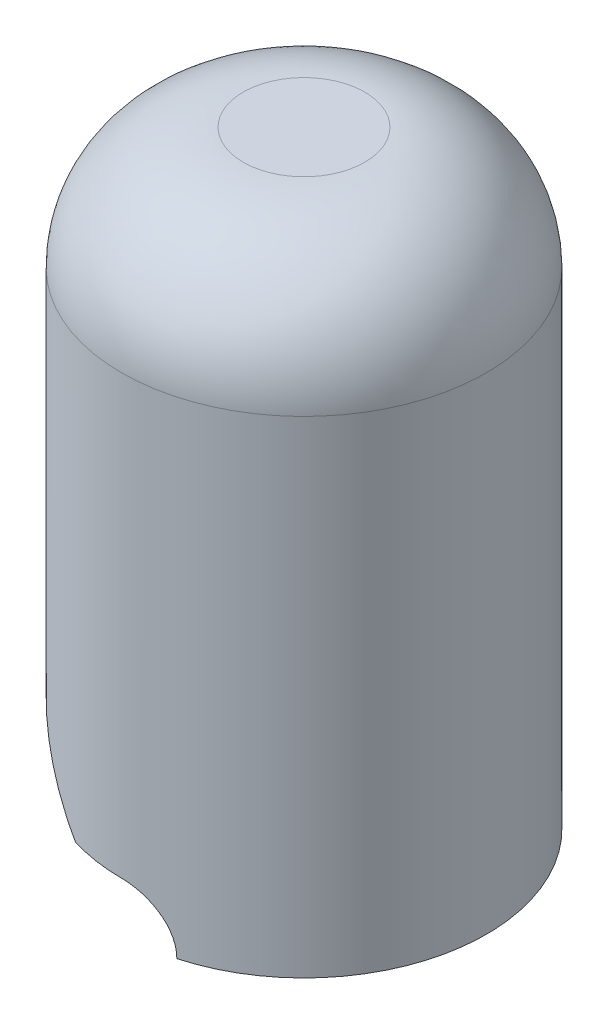
ISO-10303-21;
HEADER;
FILE_DESCRIPTION(('STEP AP214'),'2;1');
FILE_NAME('part.step','',(''),(''),'','','');
FILE_SCHEMA(('AUTOMOTIVE_DESIGN { 1 0 10303 214 1 1 1 1 }'));
ENDSEC;
DATA;
#1=APPLICATION_CONTEXT('core data for automotive mechanical design processes');
#2=APPLICATION_PROTOCOL_DEFINITION('international standard','automotive_design',2000,#1);
#3=PRODUCT_CONTEXT('',#1,'mechanical');
#4=PRODUCT('Part','Part','',(#3));
#5=PRODUCT_RELATED_PRODUCT_CATEGORY('part','',(#4));
#6=PRODUCT_DEFINITION_FORMATION('','',#4);
#7=PRODUCT_DEFINITION_CONTEXT('part definition',#1,'design');
#8=PRODUCT_DEFINITION('design','',#6,#7);
#9=PRODUCT_DEFINITION_SHAPE('','',#8);
#10=(LENGTH_UNIT() NAMED_UNIT(*) SI_UNIT(.MILLI.,.METRE.));
#11=(NAMED_UNIT(*) PLANE_ANGLE_UNIT() SI_UNIT($,.RADIAN.));
#12=(NAMED_UNIT(*) SI_UNIT($,.STERADIAN.) SOLID_ANGLE_UNIT());
#13=UNCERTAINTY_MEASURE_WITH_UNIT(LENGTH_MEASURE(1.E-05),#10,'distance_accuracy_value','');
#14=(GEOMETRIC_REPRESENTATION_CONTEXT(3) GLOBAL_UNCERTAINTY_ASSIGNED_CONTEXT((#13)) GLOBAL_UNIT_ASSIGNED_CONTEXT((#10,
#11,#12)) REPRESENTATION_CONTEXT('',''));
#15=CARTESIAN_POINT('',(0.,0.,0.));
#16=DIRECTION('',(0.,0.,1.));
#17=DIRECTION('',(1.,0.,0.));
#18=AXIS2_PLACEMENT_3D('',#15,#16,#17);
#19=CARTESIAN_POINT('',(0.,0.,-15.5));
#20=DIRECTION('',(0.,0.,1.));
#21=DIRECTION('',(1.,0.,0.));
#22=AXIS2_PLACEMENT_3D('',#19,#20,#21);
#23=CYLINDRICAL_SURFACE('',#22,4.);
#24=DIRECTION('',(0.,0.,1.));
#25=VECTOR('',#24,1.);
#26=CARTESIAN_POINT('',(0.,4.,-15.));
#27=LINE('',#26,#25);
#28=CARTESIAN_POINT('',(0.,4.,-15.));
#29=VERTEX_POINT('',#28);
#30=CARTESIAN_POINT('',(0.,4.,-7.5));
#31=VERTEX_POINT('',#30);
#32=EDGE_CURVE('E90',#29,#31,#27,.T.);
#33=ORIENTED_EDGE('',*,*,#32,.F.);
#34=CARTESIAN_POINT('',(4.,0.,-14.456832294801));
#35=CARTESIAN_POINT('',(4.00001309389174,0.110358243404115,-14.4568189842467));
#36=CARTESIAN_POINT('',(3.99543311151603,0.220708521992893,-14.4580956467717));
#37=CARTESIAN_POINT('',(3.97718874589725,0.440578653966077,-14.4631301353517));
#38=CARTESIAN_POINT('',(3.96352604983924,0.550098657759752,-14.4668875005959));
#39=CARTESIAN_POINT('',(3.92725695741263,0.767301653514034,-14.4767740441058));
#40=CARTESIAN_POINT('',(3.90466984692446,0.874988087848283,-14.482898107258));
#41=CARTESIAN_POINT('',(3.85076543838184,1.08797486035564,-14.4973231400467));
#42=CARTESIAN_POINT('',(3.81944798699437,1.19327515658533,-14.5056241479174));
#43=CARTESIAN_POINT('',(3.71275643853686,1.50446341877534,-14.5334412456827));
#44=CARTESIAN_POINT('',(3.62460332607936,1.70587493354743,-14.5558829598252));
#45=CARTESIAN_POINT('',(3.4169578047582,2.09102075962575,-14.6060171290377));
#46=CARTESIAN_POINT('',(3.29745504324306,2.27474920397244,-14.6337113178035));
#47=CARTESIAN_POINT('',(3.0273032087801,2.62397057692782,-14.6920016406366));
#48=CARTESIAN_POINT('',(2.87601544465619,2.78896184096574,-14.7226489452442));
#49=CARTESIAN_POINT('',(2.54795832924028,3.09155756696164,-14.7829523618628));
#50=CARTESIAN_POINT('',(2.37118484921249,3.22915758286841,-14.8126083123117));
#51=CARTESIAN_POINT('',(1.99367199592156,3.47517213018545,-14.8681604116921));
#52=CARTESIAN_POINT('',(1.79259414843396,3.58308396557832,-14.8939887414057));
#53=CARTESIAN_POINT('',(1.3743557555279,3.76337288896126,-14.9383834129136));
#54=CARTESIAN_POINT('',(1.15719869214847,3.83575764477688,-14.9569513215518));
#55=CARTESIAN_POINT('',(0.718234307369674,3.94130982516927,-14.9843709217852));
#56=CARTESIAN_POINT('',(0.496647293428108,3.97533721289364,-14.9934353394137));
#57=CARTESIAN_POINT('',(0.0507319917605784,4.00591431322299,-15.0015705103632));
#58=CARTESIAN_POINT('',(-0.173595891963455,4.00246948419253,-15.0006427191926));
#59=CARTESIAN_POINT('',(-0.612629502642172,3.95880431363185,-14.9890534931376));
#60=CARTESIAN_POINT('',(-0.827435206418326,3.91951387234369,-14.9786381919443));
#61=CARTESIAN_POINT('',(-1.24728467665105,3.80677484913675,-14.9495347795912));
#62=CARTESIAN_POINT('',(-1.45232797980576,3.73332464784928,-14.9308462762364));
#63=CARTESIAN_POINT('',(-1.84920963545355,3.55364003374718,-14.8869312076945));
#64=CARTESIAN_POINT('',(-2.04089626466617,3.4470866277702,-14.8616414267933));
#65=CARTESIAN_POINT('',(-2.40398441957148,3.20445723103536,-14.8072486052897));
#66=CARTESIAN_POINT('',(-2.57538239000351,3.06837607781686,-14.7781448982353));
#67=CARTESIAN_POINT('',(-2.89854935036781,2.76567202889861,-14.7182294237973));
#68=CARTESIAN_POINT('',(-3.04955722400809,2.5982419921057,-14.6873926412643));
#69=CARTESIAN_POINT('',(-3.32161448391783,2.23995715929082,-14.6282716207252));
#70=CARTESIAN_POINT('',(-3.4426555807802,2.04909590351884,-14.5999880903709));
#71=CARTESIAN_POINT('',(-3.59932937334133,1.74864671663539,-14.5618587427771));
#72=CARTESIAN_POINT('',(-3.64754371945348,1.64571108495902,-14.5498268172621));
#73=CARTESIAN_POINT('',(-3.73509417643327,1.43595367872854,-14.5275984074125));
#74=CARTESIAN_POINT('',(-3.77443385857864,1.32913348753725,-14.5174011851057));
#75=CARTESIAN_POINT('',(-3.843867838105,1.11248058077981,-14.4991713081511));
#76=CARTESIAN_POINT('',(-3.87397173088604,1.00265112180704,-14.4911364080612));
#77=CARTESIAN_POINT('',(-3.92471856960774,0.780724778875048,-14.4774747012191));
#78=CARTESIAN_POINT('',(-3.9453659249532,0.66862897718001,-14.4718467722231));
#79=CARTESIAN_POINT('',(-3.97411378733402,0.463748975282038,-14.4639761334309));
#80=CARTESIAN_POINT('',(-3.98382319960777,0.371203553832668,-14.4613012625133));
#81=CARTESIAN_POINT('',(-3.99676420153356,0.185774646690122,-14.4577275048596));
#82=CARTESIAN_POINT('',(-4.00000603663184,0.0928919295675441,-14.4568258092259));
#83=CARTESIAN_POINT('',(-4.,0.,-14.456832294801));
#84=B_SPLINE_CURVE_WITH_KNOTS('',3,(#34,#35,#36,#37,#38,#39,#40,#41,#42,#43,#44,#45,#46,#47,#48,
#49,#50,#51,#52,#53,#54,#55,#56,#57,#58,#59,#60,#61,#62,#63,#64,#65,#66,#67,#68,#69,#70,#71,#72,
#73,#74,#75,#76,#77,#78,#79,#80,#81,#82,#83),.UNSPECIFIED.,.F.,.F.,(4,2,2,2,2,2,2,2,2,2,2,2,2,2,
2,2,2,2,2,2,2,2,2,2,4),(0.,0.330958670878052,0.661855880768517,0.992041890688583,
1.32223370010825,1.98190700187181,2.64179842357631,3.3164963753615,3.99130375261119,
4.67691814590524,5.36238449759351,6.03215661862343,6.7018311790669,7.35461236515045,
8.00742449996358,8.66673340793703,9.32615767867958,10.0057598785669,10.6855498604333,
11.0281077435251,11.3705275300852,11.7125903499582,12.0544935096114,12.3335333037377,
12.6121307120356),.UNSPECIFIED.);
#85=CARTESIAN_POINT('',(4.,0.,-14.456832294801));
#86=VERTEX_POINT('',#85);
#87=EDGE_CURVE('E97',#86,#29,#84,.T.);
#88=ORIENTED_EDGE('',*,*,#87,.F.);
#89=DIRECTION('',(0.,0.,1.));
#90=VECTOR('',#89,1.);
#91=CARTESIAN_POINT('',(4.,0.,-15.5));
#92=LINE('',#91,#90);
#93=CARTESIAN_POINT('',(4.,0.,-7.5));
#94=VERTEX_POINT('',#93);
#95=EDGE_CURVE('E151',#94,#86,#92,.F.);
#96=ORIENTED_EDGE('',*,*,#95,.F.);
#97=CARTESIAN_POINT('',(0.,0.,-7.5));
#98=DIRECTION('',(0.,0.,1.));
#99=DIRECTION('',(1.,0.,0.));
#100=AXIS2_PLACEMENT_3D('',#97,#98,#99);
#101=CIRCLE('',#100,4.);
#102=EDGE_CURVE('E92',#94,#31,#101,.T.);
#103=ORIENTED_EDGE('',*,*,#102,.T.);
#104=EDGE_LOOP('',(#33,#88,#96,#103));
#105=FACE_BOUND('',#104,.T.);
#106=ADVANCED_FACE('F39',(#105),#23,.F.);
#107=CARTESIAN_POINT('',(0.,50.,0.));
#108=DIRECTION('',(0.,-1.,0.));
#109=DIRECTION('',(0.,0.,-1.));
#110=AXIS2_PLACEMENT_3D('',#107,#108,#109);
#111=CYLINDRICAL_SURFACE('',#110,15.);
#112=CARTESIAN_POINT('',(0.,40.,0.));
#113=DIRECTION('',(0.,1.,0.));
#114=DIRECTION('',(0.,0.,1.));
#115=AXIS2_PLACEMENT_3D('',#112,#113,#114);
#116=CIRCLE('',#115,15.);
#117=CARTESIAN_POINT('',(0.,40.,15.));
#118=VERTEX_POINT('',#117);
#119=EDGE_CURVE('E156',#118,#118,#116,.F.);
#120=ORIENTED_EDGE('',*,*,#119,.T.);
#121=EDGE_LOOP('',(#120));
#122=FACE_BOUND('',#121,.T.);
#123=ORIENTED_EDGE('',*,*,#87,.T.);
#124=CARTESIAN_POINT('',(0.,4.,0.));
#125=DIRECTION('',(0.,1.,0.));
#126=DIRECTION('',(0.,0.,1.));
#127=AXIS2_PLACEMENT_3D('',#124,#125,#126);
#128=CIRCLE('',#127,15.);
#129=CARTESIAN_POINT('',(-4.48548697178214,4.,-14.3136440722121));
#130=VERTEX_POINT('',#129);
#131=EDGE_CURVE('E82',#29,#130,#128,.T.);
#132=ORIENTED_EDGE('',*,*,#131,.T.);
#133=CARTESIAN_POINT('',(0.,0.,0.));
#134=DIRECTION('',(0.665562071979514,0.746342500694109,0.));
#135=DIRECTION('',(0.746342500694109,-0.665562071979514,0.));
#136=AXIS2_PLACEMENT_3D('',#133,#134,#135);
#137=ELLIPSE('',#136,20.0980112830903,15.);
#138=CARTESIAN_POINT('',(-4.48548697178214,4.,14.3136440722121));
#139=VERTEX_POINT('',#138);
#140=EDGE_CURVE('E50',#130,#139,#137,.T.);
#141=ORIENTED_EDGE('',*,*,#140,.T.);
#142=CARTESIAN_POINT('',(0.,4.,15.));
#143=VERTEX_POINT('',#142);
#144=EDGE_CURVE('E53',#139,#143,#128,.T.);
#145=ORIENTED_EDGE('',*,*,#144,.T.);
#146=CARTESIAN_POINT('',(4.,0.,14.456832294801));
#147=CARTESIAN_POINT('',(4.00001309389174,0.110358243404115,14.4568189842467));
#148=CARTESIAN_POINT('',(3.99543311151603,0.220708521992893,14.4580956467717));
#149=CARTESIAN_POINT('',(3.97718874589725,0.440578653966077,14.4631301353517));
#150=CARTESIAN_POINT('',(3.96352604983924,0.550098657759752,14.4668875005959));
#151=CARTESIAN_POINT('',(3.92725695741263,0.767301653514034,14.4767740441058));
#152=CARTESIAN_POINT('',(3.90466984692446,0.874988087848283,14.482898107258));
#153=CARTESIAN_POINT('',(3.85076543838184,1.08797486035564,14.4973231400467));
#154=CARTESIAN_POINT('',(3.81944798699437,1.19327515658533,14.5056241479174));
#155=CARTESIAN_POINT('',(3.71275643853686,1.50446341877534,14.5334412456827));
#156=CARTESIAN_POINT('',(3.62460332607936,1.70587493354743,14.5558829598252));
#157=CARTESIAN_POINT('',(3.4169578047582,2.09102075962575,14.6060171290377));
#158=CARTESIAN_POINT('',(3.29745504324306,2.27474920397244,14.6337113178035));
#159=CARTESIAN_POINT('',(3.0273032087801,2.62397057692782,14.6920016406366));
#160=CARTESIAN_POINT('',(2.87601544465619,2.78896184096574,14.7226489452442));
#161=CARTESIAN_POINT('',(2.54795832924028,3.09155756696164,14.7829523618628));
#162=CARTESIAN_POINT('',(2.37118484921249,3.22915758286841,14.8126083123117));
#163=CARTESIAN_POINT('',(1.99367199592156,3.47517213018545,14.8681604116921));
#164=CARTESIAN_POINT('',(1.79259414843396,3.58308396557832,14.8939887414057));
#165=CARTESIAN_POINT('',(1.3743557555279,3.76337288896126,14.9383834129136));
#166=CARTESIAN_POINT('',(1.15719869214847,3.83575764477688,14.9569513215518));
#167=CARTESIAN_POINT('',(0.718234307369674,3.94130982516927,14.9843709217852));
#168=CARTESIAN_POINT('',(0.496647293428108,3.97533721289364,14.9934353394137));
#169=CARTESIAN_POINT('',(0.0507319917605784,4.00591431322299,15.0015705103632));
#170=CARTESIAN_POINT('',(-0.173595891963455,4.00246948419253,15.0006427191926));
#171=CARTESIAN_POINT('',(-0.612629502642172,3.95880431363185,14.9890534931376));
#172=CARTESIAN_POINT('',(-0.827435206418326,3.91951387234369,14.9786381919443));
#173=CARTESIAN_POINT('',(-1.24728467665105,3.80677484913675,14.9495347795912));
#174=CARTESIAN_POINT('',(-1.45232797980576,3.73332464784928,14.9308462762364));
#175=CARTESIAN_POINT('',(-1.84920963545355,3.55364003374718,14.8869312076945));
#176=CARTESIAN_POINT('',(-2.04089626466617,3.4470866277702,14.8616414267933));
#177=CARTESIAN_POINT('',(-2.40398441957148,3.20445723103536,14.8072486052897));
#178=CARTESIAN_POINT('',(-2.57538239000351,3.06837607781686,14.7781448982353));
#179=CARTESIAN_POINT('',(-2.89854935036781,2.76567202889861,14.7182294237973));
#180=CARTESIAN_POINT('',(-3.04955722400809,2.5982419921057,14.6873926412643));
#181=CARTESIAN_POINT('',(-3.32161448391783,2.23995715929082,14.6282716207252));
#182=CARTESIAN_POINT('',(-3.4426555807802,2.04909590351884,14.5999880903709));
#183=CARTESIAN_POINT('',(-3.59932937334133,1.74864671663539,14.5618587427771));
#184=CARTESIAN_POINT('',(-3.64754371945348,1.64571108495902,14.5498268172621));
#185=CARTESIAN_POINT('',(-3.73509417643327,1.43595367872854,14.5275984074125));
#186=CARTESIAN_POINT('',(-3.77443385857864,1.32913348753725,14.5174011851057));
#187=CARTESIAN_POINT('',(-3.843867838105,1.11248058077981,14.4991713081511));
#188=CARTESIAN_POINT('',(-3.87397173088604,1.00265112180704,14.4911364080612));
#189=CARTESIAN_POINT('',(-3.92471856960774,0.780724778875048,14.4774747012191));
#190=CARTESIAN_POINT('',(-3.9453659249532,0.66862897718001,14.4718467722231));
#191=CARTESIAN_POINT('',(-3.97411378733402,0.463748975282038,14.4639761334309));
#192=CARTESIAN_POINT('',(-3.98382319960777,0.371203553832668,14.4613012625133));
#193=CARTESIAN_POINT('',(-3.99676420153356,0.185774646690122,14.4577275048596));
#194=CARTESIAN_POINT('',(-4.00000603663184,0.0928919295675441,14.4568258092259));
#195=CARTESIAN_POINT('',(-4.,0.,14.456832294801));
#196=B_SPLINE_CURVE_WITH_KNOTS('',3,(#146,#147,#148,#149,#150,#151,#152,#153,#154,#155,#156,
#157,#158,#159,#160,#161,#162,#163,#164,#165,#166,#167,#168,#169,#170,#171,#172,#173,#174,#175,
#176,#177,#178,#179,#180,#181,#182,#183,#184,#185,#186,#187,#188,#189,#190,#191,#192,#193,#194,
#195),.UNSPECIFIED.,.F.,.F.,(4,2,2,2,2,2,2,2,2,2,2,2,2,2,2,2,2,2,2,2,2,2,2,2,4),(0.,
0.330958670878052,0.661855880768517,0.992041890688583,1.32223370010825,1.98190700187181,
2.64179842357631,3.3164963753615,3.99130375261119,4.67691814590524,5.36238449759351,
6.03215661862343,6.7018311790669,7.35461236515045,8.00742449996358,8.66673340793703,
9.32615767867958,10.0057598785669,10.6855498604333,11.0281077435251,11.3705275300852,
11.7125903499582,12.0544935096114,12.3335333037377,12.6121307120356),.UNSPECIFIED.);
#197=CARTESIAN_POINT('',(4.,0.,14.456832294801));
#198=VERTEX_POINT('',#197);
#199=EDGE_CURVE('E115',#198,#143,#196,.T.);
#200=ORIENTED_EDGE('',*,*,#199,.F.);
#201=CARTESIAN_POINT('',(0.,0.,0.));
#202=DIRECTION('',(0.,1.,0.));
#203=DIRECTION('',(0.,0.,1.));
#204=AXIS2_PLACEMENT_3D('',#201,#202,#203);
#205=CIRCLE('',#204,15.);
#206=EDGE_CURVE('E107',#198,#86,#205,.T.);
#207=ORIENTED_EDGE('',*,*,#206,.T.);
#208=EDGE_LOOP('',(#123,#132,#141,#145,#200,#207));
#209=FACE_BOUND('',#208,.T.);
#210=ADVANCED_FACE('F104',(#122,#209),#111,.T.);
#211=CARTESIAN_POINT('',(0.,0.,0.));
#212=DIRECTION('',(0.,1.,0.));
#213=DIRECTION('',(0.,0.,1.));
#214=AXIS2_PLACEMENT_3D('',#211,#212,#213);
#215=PLANE('',#214);
#216=DIRECTION('',(0.,0.,-1.));
#217=VECTOR('',#216,1.);
#218=CARTESIAN_POINT('',(4.,0.,7.5));
#219=LINE('',#218,#217);
#220=CARTESIAN_POINT('',(4.,0.,7.5));
#221=VERTEX_POINT('',#220);
#222=EDGE_CURVE('E150',#94,#221,#219,.F.);
#223=ORIENTED_EDGE('',*,*,#222,.F.);
#224=ORIENTED_EDGE('',*,*,#95,.T.);
#225=ORIENTED_EDGE('',*,*,#206,.F.);
#226=DIRECTION('',(0.,0.,-1.));
#227=VECTOR('',#226,1.);
#228=CARTESIAN_POINT('',(4.,0.,15.5));
#229=LINE('',#228,#227);
#230=EDGE_CURVE('E149',#221,#198,#229,.F.);
#231=ORIENTED_EDGE('',*,*,#230,.F.);
#232=EDGE_LOOP('',(#223,#224,#225,#231));
#233=FACE_BOUND('',#232,.T.);
#234=ADVANCED_FACE('F171',(#233),#215,.F.);
#235=CARTESIAN_POINT('',(0.,50.,0.));
#236=DIRECTION('',(0.,1.,0.));
#237=DIRECTION('',(0.,0.,1.));
#238=AXIS2_PLACEMENT_3D('',#235,#236,#237);
#239=PLANE('',#238);
#240=CARTESIAN_POINT('',(0.,50.,0.));
#241=DIRECTION('',(0.,1.,0.));
#242=DIRECTION('',(0.,0.,1.));
#243=AXIS2_PLACEMENT_3D('',#240,#241,#242);
#244=CIRCLE('',#243,5.);
#245=CARTESIAN_POINT('',(0.,50.,5.));
#246=VERTEX_POINT('',#245);
#247=EDGE_CURVE('E153',#246,#246,#244,.T.);
#248=ORIENTED_EDGE('',*,*,#247,.T.);
#249=EDGE_LOOP('',(#248));
#250=FACE_BOUND('',#249,.T.);
#251=ADVANCED_FACE('F172',(#250),#239,.T.);
#252=CARTESIAN_POINT('',(0.,0.,7.5));
#253=DIRECTION('',(0.,0.,-1.));
#254=DIRECTION('',(-1.,0.,0.));
#255=AXIS2_PLACEMENT_3D('',#252,#253,#254);
#256=CYLINDRICAL_SURFACE('',#255,4.);
#257=CARTESIAN_POINT('',(0.,0.,-7.5));
#258=DIRECTION('',(0.,0.,1.));
#259=DIRECTION('',(1.,0.,0.));
#260=AXIS2_PLACEMENT_3D('',#257,#258,#259);
#261=CIRCLE('',#260,4.);
#262=EDGE_CURVE('E63',#31,#94,#261,.T.);
#263=ORIENTED_EDGE('',*,*,#262,.T.);
#264=ORIENTED_EDGE('',*,*,#222,.T.);
#265=CARTESIAN_POINT('',(0.,0.,7.5));
#266=DIRECTION('',(0.,0.,1.));
#267=DIRECTION('',(1.,0.,0.));
#268=AXIS2_PLACEMENT_3D('',#265,#266,#267);
#269=CIRCLE('',#268,4.);
#270=CARTESIAN_POINT('',(0.,4.,7.5));
#271=VERTEX_POINT('',#270);
#272=EDGE_CURVE('E141',#271,#221,#269,.T.);
#273=ORIENTED_EDGE('',*,*,#272,.F.);
#274=EDGE_CURVE('E101',#31,#271,#27,.T.);
#275=ORIENTED_EDGE('',*,*,#274,.F.);
#276=EDGE_LOOP('',(#263,#264,#273,#275));
#277=FACE_BOUND('',#276,.T.);
#278=ADVANCED_FACE('F175',(#277),#256,.T.);
#279=CARTESIAN_POINT('',(0.,0.,7.5));
#280=DIRECTION('',(0.,0.,1.));
#281=DIRECTION('',(1.,0.,0.));
#282=AXIS2_PLACEMENT_3D('',#279,#280,#281);
#283=PLANE('',#282);
#284=CARTESIAN_POINT('',(0.,0.,7.5));
#285=DIRECTION('',(0.,0.,1.));
#286=DIRECTION('',(1.,0.,0.));
#287=AXIS2_PLACEMENT_3D('',#284,#285,#286);
#288=CIRCLE('',#287,2.5);
#289=CARTESIAN_POINT('',(2.5,0.,7.5));
#290=VERTEX_POINT('',#289);
#291=EDGE_CURVE('E198',#290,#290,#288,.T.);
#292=ORIENTED_EDGE('',*,*,#291,.F.);
#293=EDGE_LOOP('',(#292));
#294=FACE_BOUND('',#293,.T.);
#295=ORIENTED_EDGE('',*,*,#272,.T.);
#296=CARTESIAN_POINT('',(0.,0.,7.5));
#297=DIRECTION('',(0.,0.,1.));
#298=DIRECTION('',(1.,0.,0.));
#299=AXIS2_PLACEMENT_3D('',#296,#297,#298);
#300=CIRCLE('',#299,4.);
#301=EDGE_CURVE('E108',#221,#271,#300,.T.);
#302=ORIENTED_EDGE('',*,*,#301,.T.);
#303=EDGE_LOOP('',(#295,#302));
#304=FACE_BOUND('',#303,.T.);
#305=ADVANCED_FACE('F131',(#294,#304),#283,.T.);
#306=CARTESIAN_POINT('',(0.,0.,-7.5));
#307=DIRECTION('',(0.,0.,1.));
#308=DIRECTION('',(1.,0.,0.));
#309=AXIS2_PLACEMENT_3D('',#306,#307,#308);
#310=PLANE('',#309);
#311=CARTESIAN_POINT('',(0.,0.,-7.5));
#312=DIRECTION('',(0.,0.,1.));
#313=DIRECTION('',(1.,0.,0.));
#314=AXIS2_PLACEMENT_3D('',#311,#312,#313);
#315=CIRCLE('',#314,2.5);
#316=CARTESIAN_POINT('',(2.5,0.,-7.5));
#317=VERTEX_POINT('',#316);
#318=EDGE_CURVE('E191',#317,#317,#315,.T.);
#319=ORIENTED_EDGE('',*,*,#318,.T.);
#320=EDGE_LOOP('',(#319));
#321=FACE_BOUND('',#320,.T.);
#322=ORIENTED_EDGE('',*,*,#262,.F.);
#323=ORIENTED_EDGE('',*,*,#102,.F.);
#324=EDGE_LOOP('',(#322,#323));
#325=FACE_BOUND('',#324,.T.);
#326=ADVANCED_FACE('F132',(#321,#325),#310,.F.);
#327=CARTESIAN_POINT('',(0.,0.,15.5));
#328=DIRECTION('',(0.,0.,-1.));
#329=DIRECTION('',(-1.,0.,0.));
#330=AXIS2_PLACEMENT_3D('',#327,#328,#329);
#331=CYLINDRICAL_SURFACE('',#330,4.);
#332=EDGE_CURVE('E103',#271,#143,#27,.T.);
#333=ORIENTED_EDGE('',*,*,#332,.F.);
#334=ORIENTED_EDGE('',*,*,#301,.F.);
#335=ORIENTED_EDGE('',*,*,#230,.T.);
#336=ORIENTED_EDGE('',*,*,#199,.T.);
#337=EDGE_LOOP('',(#333,#334,#335,#336));
#338=FACE_BOUND('',#337,.T.);
#339=ADVANCED_FACE('F129',(#338),#331,.F.);
#340=CARTESIAN_POINT('',(0.,40.,0.));
#341=DIRECTION('',(0.,1.,0.));
#342=DIRECTION('',(0.,0.,1.));
#343=AXIS2_PLACEMENT_3D('',#340,#341,#342);
#344=DEGENERATE_TOROIDAL_SURFACE('',#343,5.,10.,.T.);
#345=ORIENTED_EDGE('',*,*,#119,.F.);
#346=EDGE_LOOP('',(#345));
#347=FACE_BOUND('',#346,.T.);
#348=ORIENTED_EDGE('',*,*,#247,.F.);
#349=EDGE_LOOP('',(#348));
#350=FACE_BOUND('',#349,.T.);
#351=ADVANCED_FACE('F41',(#347,#350),#344,.T.);
#352=CARTESIAN_POINT('',(-4.,3.56705974193099,-15.));
#353=DIRECTION('',(0.665562071979514,0.746342500694109,0.));
#354=DIRECTION('',(-0.746342500694109,0.665562071979514,0.));
#355=AXIS2_PLACEMENT_3D('',#352,#353,#354);
#356=PLANE('',#355);
#357=ORIENTED_EDGE('',*,*,#140,.F.);
#358=DIRECTION('',(0.,0.,1.));
#359=VECTOR('',#358,1.);
#360=CARTESIAN_POINT('',(-4.48548697178214,4.,-15.));
#361=LINE('',#360,#359);
#362=EDGE_CURVE('E11',#130,#139,#361,.T.);
#363=ORIENTED_EDGE('',*,*,#362,.T.);
#364=EDGE_LOOP('',(#357,#363));
#365=FACE_BOUND('',#364,.T.);
#366=ADVANCED_FACE('F130',(#365),#356,.F.);
#367=CARTESIAN_POINT('',(0.,4.,-15.));
#368=DIRECTION('',(0.,1.,0.));
#369=DIRECTION('',(0.,0.,1.));
#370=AXIS2_PLACEMENT_3D('',#367,#368,#369);
#371=PLANE('',#370);
#372=ORIENTED_EDGE('',*,*,#32,.T.);
#373=ORIENTED_EDGE('',*,*,#274,.T.);
#374=ORIENTED_EDGE('',*,*,#332,.T.);
#375=ORIENTED_EDGE('',*,*,#144,.F.);
#376=ORIENTED_EDGE('',*,*,#362,.F.);
#377=ORIENTED_EDGE('',*,*,#131,.F.);
#378=EDGE_LOOP('',(#372,#373,#374,#375,#376,#377));
#379=FACE_BOUND('',#378,.T.);
#380=ADVANCED_FACE('F87',(#379),#371,.F.);
#381=CARTESIAN_POINT('',(0.,0.,-7.5));
#382=DIRECTION('',(0.,0.,1.));
#383=DIRECTION('',(1.,0.,0.));
#384=AXIS2_PLACEMENT_3D('',#381,#382,#383);
#385=CYLINDRICAL_SURFACE('',#384,2.5);
#386=ORIENTED_EDGE('',*,*,#318,.F.);
#387=EDGE_LOOP('',(#386));
#388=FACE_BOUND('',#387,.T.);
#389=ORIENTED_EDGE('',*,*,#291,.T.);
#390=EDGE_LOOP('',(#389));
#391=FACE_BOUND('',#390,.T.);
#392=ADVANCED_FACE('F162',(#388,#391),#385,.F.);
#393=CLOSED_SHELL('',(#106,#210,#234,#251,#278,#305,#326,#339,#351,#366,#380,#392));
#394=MANIFOLD_SOLID_BREP('B2',#393);
#395=ADVANCED_BREP_SHAPE_REPRESENTATION('',(#18,#394),#14);
#396=SHAPE_DEFINITION_REPRESENTATION(#9,#395);
ENDSEC;
END-ISO-10303-21;
